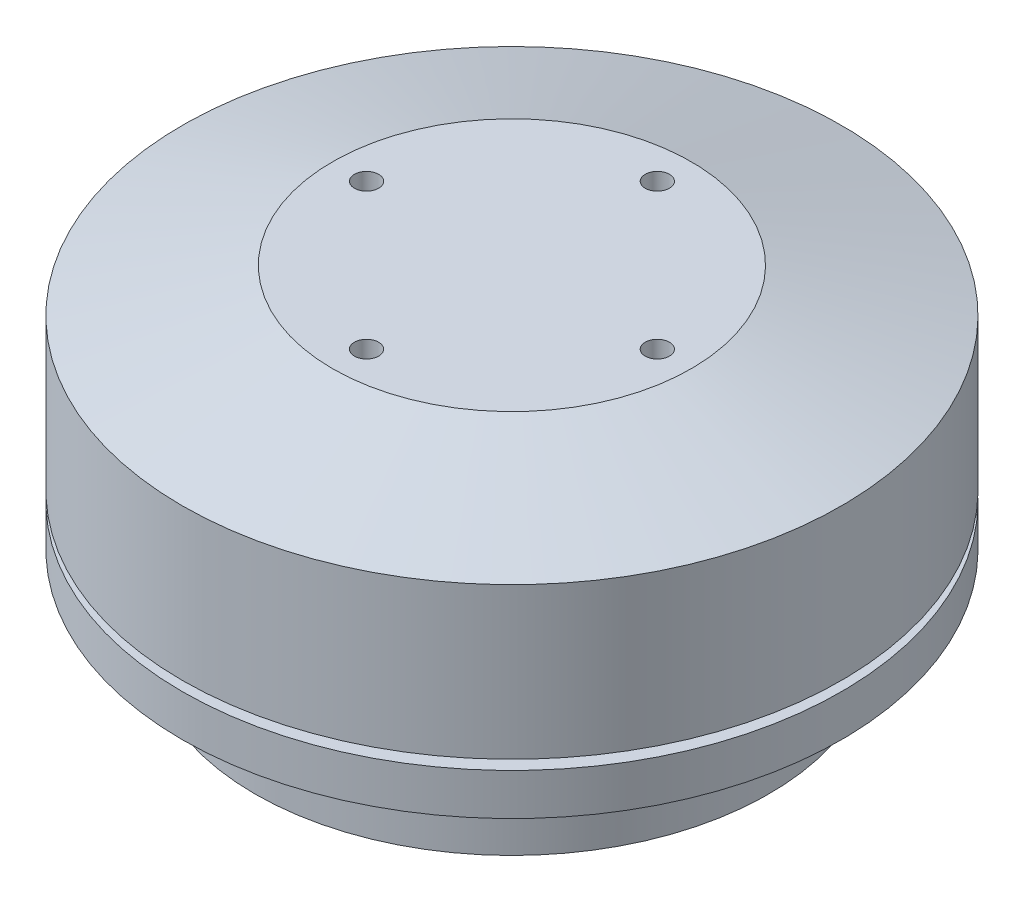
ISO-10303-21;
HEADER;
FILE_DESCRIPTION(('STEP AP214'),'2;1');
FILE_NAME('part.step','',(''),(''),'','','');
FILE_SCHEMA(('AUTOMOTIVE_DESIGN { 1 0 10303 214 1 1 1 1 }'));
ENDSEC;
DATA;
#1=APPLICATION_CONTEXT('core data for automotive mechanical design processes');
#2=APPLICATION_PROTOCOL_DEFINITION('international standard','automotive_design',2000,#1);
#3=PRODUCT_CONTEXT('',#1,'mechanical');
#4=PRODUCT('Part','Part','',(#3));
#5=PRODUCT_RELATED_PRODUCT_CATEGORY('part','',(#4));
#6=PRODUCT_DEFINITION_FORMATION('','',#4);
#7=PRODUCT_DEFINITION_CONTEXT('part definition',#1,'design');
#8=PRODUCT_DEFINITION('design','',#6,#7);
#9=PRODUCT_DEFINITION_SHAPE('','',#8);
#10=(LENGTH_UNIT() NAMED_UNIT(*) SI_UNIT(.MILLI.,.METRE.));
#11=(NAMED_UNIT(*) PLANE_ANGLE_UNIT() SI_UNIT($,.RADIAN.));
#12=(NAMED_UNIT(*) SI_UNIT($,.STERADIAN.) SOLID_ANGLE_UNIT());
#13=UNCERTAINTY_MEASURE_WITH_UNIT(LENGTH_MEASURE(1.E-05),#10,'distance_accuracy_value','');
#14=(GEOMETRIC_REPRESENTATION_CONTEXT(3) GLOBAL_UNCERTAINTY_ASSIGNED_CONTEXT((#13)) GLOBAL_UNIT_ASSIGNED_CONTEXT((#10,
#11,#12)) REPRESENTATION_CONTEXT('',''));
#15=CARTESIAN_POINT('',(0.,0.,0.));
#16=DIRECTION('',(0.,0.,1.));
#17=DIRECTION('',(1.,0.,0.));
#18=AXIS2_PLACEMENT_3D('',#15,#16,#17);
#19=CARTESIAN_POINT('',(-26.5,0.,0.));
#20=DIRECTION('',(0.,-1.,0.));
#21=DIRECTION('',(0.,0.,-1.));
#22=AXIS2_PLACEMENT_3D('',#19,#20,#21);
#23=PLANE('',#22);
#24=CARTESIAN_POINT('',(0.,0.,-15.));
#25=DIRECTION('',(0.,-1.,0.));
#26=DIRECTION('',(0.,0.,-1.));
#27=AXIS2_PLACEMENT_3D('',#24,#25,#26);
#28=CIRCLE('',#27,1.24999999999999);
#29=CARTESIAN_POINT('',(0.,0.,-16.25));
#30=VERTEX_POINT('',#29);
#31=EDGE_CURVE('E81',#30,#30,#28,.T.);
#32=ORIENTED_EDGE('',*,*,#31,.F.);
#33=EDGE_LOOP('',(#32));
#34=FACE_BOUND('',#33,.T.);
#35=CARTESIAN_POINT('',(0.,0.,15.));
#36=DIRECTION('',(0.,-1.,0.));
#37=DIRECTION('',(0.,0.,-1.));
#38=AXIS2_PLACEMENT_3D('',#35,#36,#37);
#39=CIRCLE('',#38,1.24999999999999);
#40=CARTESIAN_POINT('',(0.,0.,13.75));
#41=VERTEX_POINT('',#40);
#42=EDGE_CURVE('E80',#41,#41,#39,.T.);
#43=ORIENTED_EDGE('',*,*,#42,.F.);
#44=EDGE_LOOP('',(#43));
#45=FACE_BOUND('',#44,.T.);
#46=CARTESIAN_POINT('',(-15.,0.,0.));
#47=DIRECTION('',(0.,-1.,0.));
#48=DIRECTION('',(0.,0.,-1.));
#49=AXIS2_PLACEMENT_3D('',#46,#47,#48);
#50=CIRCLE('',#49,1.24999999999999);
#51=CARTESIAN_POINT('',(-15.,0.,-1.24999999999999));
#52=VERTEX_POINT('',#51);
#53=EDGE_CURVE('E91',#52,#52,#50,.T.);
#54=ORIENTED_EDGE('',*,*,#53,.F.);
#55=EDGE_LOOP('',(#54));
#56=FACE_BOUND('',#55,.T.);
#57=CARTESIAN_POINT('',(15.,0.,0.));
#58=DIRECTION('',(0.,-1.,0.));
#59=DIRECTION('',(0.,0.,-1.));
#60=AXIS2_PLACEMENT_3D('',#57,#58,#59);
#61=CIRCLE('',#60,1.24999999999999);
#62=CARTESIAN_POINT('',(15.,0.,-1.24999999999999));
#63=VERTEX_POINT('',#62);
#64=EDGE_CURVE('E97',#63,#63,#61,.T.);
#65=ORIENTED_EDGE('',*,*,#64,.F.);
#66=EDGE_LOOP('',(#65));
#67=FACE_BOUND('',#66,.T.);
#68=CARTESIAN_POINT('',(0.,0.,0.));
#69=DIRECTION('',(0.,1.,0.));
#70=DIRECTION('',(0.,0.,1.));
#71=AXIS2_PLACEMENT_3D('',#68,#69,#70);
#72=CIRCLE('',#71,26.5);
#73=CARTESIAN_POINT('',(0.,0.,26.5));
#74=VERTEX_POINT('',#73);
#75=EDGE_CURVE('E127',#74,#74,#72,.T.);
#76=ORIENTED_EDGE('',*,*,#75,.F.);
#77=EDGE_LOOP('',(#76));
#78=FACE_BOUND('',#77,.T.);
#79=ADVANCED_FACE('F38',(#34,#45,#56,#67,#78),#23,.T.);
#80=CARTESIAN_POINT('',(0.,34.,0.));
#81=DIRECTION('',(0.,1.,0.));
#82=DIRECTION('',(0.,0.,1.));
#83=AXIS2_PLACEMENT_3D('',#80,#81,#82);
#84=PLANE('',#83);
#85=CARTESIAN_POINT('',(0.,34.,-15.));
#86=DIRECTION('',(0.,1.,0.));
#87=DIRECTION('',(0.,0.,1.));
#88=AXIS2_PLACEMENT_3D('',#85,#86,#87);
#89=CIRCLE('',#88,1.24999999999999);
#90=CARTESIAN_POINT('',(0.,34.,-13.75));
#91=VERTEX_POINT('',#90);
#92=EDGE_CURVE('E103',#91,#91,#89,.T.);
#93=ORIENTED_EDGE('',*,*,#92,.F.);
#94=EDGE_LOOP('',(#93));
#95=FACE_BOUND('',#94,.T.);
#96=CARTESIAN_POINT('',(-15.,34.,0.));
#97=DIRECTION('',(0.,1.,0.));
#98=DIRECTION('',(0.,0.,1.));
#99=AXIS2_PLACEMENT_3D('',#96,#97,#98);
#100=CIRCLE('',#99,1.24999999999999);
#101=CARTESIAN_POINT('',(-15.,34.,1.24999999999999));
#102=VERTEX_POINT('',#101);
#103=EDGE_CURVE('E109',#102,#102,#100,.T.);
#104=ORIENTED_EDGE('',*,*,#103,.F.);
#105=EDGE_LOOP('',(#104));
#106=FACE_BOUND('',#105,.T.);
#107=CARTESIAN_POINT('',(15.,34.,0.));
#108=DIRECTION('',(0.,1.,0.));
#109=DIRECTION('',(0.,0.,1.));
#110=AXIS2_PLACEMENT_3D('',#107,#108,#109);
#111=CIRCLE('',#110,1.24999999999999);
#112=CARTESIAN_POINT('',(15.,34.,1.24999999999999));
#113=VERTEX_POINT('',#112);
#114=EDGE_CURVE('E115',#113,#113,#111,.T.);
#115=ORIENTED_EDGE('',*,*,#114,.F.);
#116=EDGE_LOOP('',(#115));
#117=FACE_BOUND('',#116,.T.);
#118=CARTESIAN_POINT('',(0.,34.,15.));
#119=DIRECTION('',(0.,1.,0.));
#120=DIRECTION('',(0.,0.,1.));
#121=AXIS2_PLACEMENT_3D('',#118,#119,#120);
#122=CIRCLE('',#121,1.24999999999999);
#123=CARTESIAN_POINT('',(0.,34.,16.25));
#124=VERTEX_POINT('',#123);
#125=EDGE_CURVE('E121',#124,#124,#122,.T.);
#126=ORIENTED_EDGE('',*,*,#125,.F.);
#127=EDGE_LOOP('',(#126));
#128=FACE_BOUND('',#127,.T.);
#129=CARTESIAN_POINT('',(0.,34.,0.));
#130=DIRECTION('',(0.,1.,0.));
#131=DIRECTION('',(0.,0.,1.));
#132=AXIS2_PLACEMENT_3D('',#129,#130,#131);
#133=CIRCLE('',#132,18.5);
#134=CARTESIAN_POINT('',(0.,34.,18.5));
#135=VERTEX_POINT('',#134);
#136=EDGE_CURVE('E11',#135,#135,#133,.T.);
#137=ORIENTED_EDGE('',*,*,#136,.T.);
#138=EDGE_LOOP('',(#137));
#139=FACE_BOUND('',#138,.T.);
#140=ADVANCED_FACE('F165',(#95,#106,#117,#128,#139),#84,.T.);
#141=CARTESIAN_POINT('',(0.,34.,0.));
#142=DIRECTION('',(0.,-1.,0.));
#143=DIRECTION('',(0.,0.,-1.));
#144=AXIS2_PLACEMENT_3D('',#141,#142,#143);
#145=CONICAL_SURFACE('',#144,18.5,1.28824137432531);
#146=CARTESIAN_POINT('',(0.,29.5,0.));
#147=DIRECTION('',(0.,1.,0.));
#148=DIRECTION('',(0.,0.,1.));
#149=AXIS2_PLACEMENT_3D('',#146,#147,#148);
#150=CIRCLE('',#149,34.);
#151=CARTESIAN_POINT('',(0.,29.5,34.));
#152=VERTEX_POINT('',#151);
#153=EDGE_CURVE('E45',#152,#152,#150,.T.);
#154=ORIENTED_EDGE('',*,*,#153,.T.);
#155=EDGE_LOOP('',(#154));
#156=FACE_BOUND('',#155,.T.);
#157=ORIENTED_EDGE('',*,*,#136,.F.);
#158=EDGE_LOOP('',(#157));
#159=FACE_BOUND('',#158,.T.);
#160=ADVANCED_FACE('F150',(#156,#159),#145,.T.);
#161=CARTESIAN_POINT('',(0.,0.,0.));
#162=DIRECTION('',(0.,1.,0.));
#163=DIRECTION('',(0.,0.,1.));
#164=AXIS2_PLACEMENT_3D('',#161,#162,#163);
#165=CYLINDRICAL_SURFACE('',#164,34.);
#166=CARTESIAN_POINT('',(0.,13.9,0.));
#167=DIRECTION('',(0.,1.,0.));
#168=DIRECTION('',(0.,0.,1.));
#169=AXIS2_PLACEMENT_3D('',#166,#167,#168);
#170=CIRCLE('',#169,34.);
#171=CARTESIAN_POINT('',(0.,13.9,34.));
#172=VERTEX_POINT('',#171);
#173=EDGE_CURVE('E145',#172,#172,#170,.T.);
#174=ORIENTED_EDGE('',*,*,#173,.T.);
#175=EDGE_LOOP('',(#174));
#176=FACE_BOUND('',#175,.T.);
#177=ORIENTED_EDGE('',*,*,#153,.F.);
#178=EDGE_LOOP('',(#177));
#179=FACE_BOUND('',#178,.T.);
#180=ADVANCED_FACE('F153',(#176,#179),#165,.T.);
#181=CARTESIAN_POINT('',(-34.,13.9,0.));
#182=DIRECTION('',(0.,-1.,0.));
#183=DIRECTION('',(0.,0.,-1.));
#184=AXIS2_PLACEMENT_3D('',#181,#182,#183);
#185=PLANE('',#184);
#186=CARTESIAN_POINT('',(0.,13.9,0.));
#187=DIRECTION('',(0.,1.,0.));
#188=DIRECTION('',(0.,0.,1.));
#189=AXIS2_PLACEMENT_3D('',#186,#187,#188);
#190=CIRCLE('',#189,32.5204744932251);
#191=CARTESIAN_POINT('',(0.,13.9,32.5204744932251));
#192=VERTEX_POINT('',#191);
#193=EDGE_CURVE('E142',#192,#192,#190,.T.);
#194=ORIENTED_EDGE('',*,*,#193,.T.);
#195=EDGE_LOOP('',(#194));
#196=FACE_BOUND('',#195,.T.);
#197=ORIENTED_EDGE('',*,*,#173,.F.);
#198=EDGE_LOOP('',(#197));
#199=FACE_BOUND('',#198,.T.);
#200=ADVANCED_FACE('F155',(#196,#199),#185,.T.);
#201=CARTESIAN_POINT('',(0.,0.,0.));
#202=DIRECTION('',(0.,1.,0.));
#203=DIRECTION('',(0.,0.,1.));
#204=AXIS2_PLACEMENT_3D('',#201,#202,#203);
#205=CYLINDRICAL_SURFACE('',#204,32.5204744932251);
#206=CARTESIAN_POINT('',(0.,12.9,0.));
#207=DIRECTION('',(0.,1.,0.));
#208=DIRECTION('',(0.,0.,1.));
#209=AXIS2_PLACEMENT_3D('',#206,#207,#208);
#210=CIRCLE('',#209,32.5204744932251);
#211=CARTESIAN_POINT('',(0.,12.9,32.5204744932251));
#212=VERTEX_POINT('',#211);
#213=EDGE_CURVE('E139',#212,#212,#210,.T.);
#214=ORIENTED_EDGE('',*,*,#213,.T.);
#215=EDGE_LOOP('',(#214));
#216=FACE_BOUND('',#215,.T.);
#217=ORIENTED_EDGE('',*,*,#193,.F.);
#218=EDGE_LOOP('',(#217));
#219=FACE_BOUND('',#218,.T.);
#220=ADVANCED_FACE('F162',(#216,#219),#205,.T.);
#221=CARTESIAN_POINT('',(-32.5204744932251,12.9,0.));
#222=DIRECTION('',(0.,1.,0.));
#223=DIRECTION('',(0.,0.,1.));
#224=AXIS2_PLACEMENT_3D('',#221,#222,#223);
#225=PLANE('',#224);
#226=CARTESIAN_POINT('',(0.,12.9,0.));
#227=DIRECTION('',(0.,1.,0.));
#228=DIRECTION('',(0.,0.,1.));
#229=AXIS2_PLACEMENT_3D('',#226,#227,#228);
#230=CIRCLE('',#229,34.);
#231=CARTESIAN_POINT('',(0.,12.9,34.));
#232=VERTEX_POINT('',#231);
#233=EDGE_CURVE('E136',#232,#232,#230,.T.);
#234=ORIENTED_EDGE('',*,*,#233,.T.);
#235=EDGE_LOOP('',(#234));
#236=FACE_BOUND('',#235,.T.);
#237=ORIENTED_EDGE('',*,*,#213,.F.);
#238=EDGE_LOOP('',(#237));
#239=FACE_BOUND('',#238,.T.);
#240=ADVANCED_FACE('F199',(#236,#239),#225,.T.);
#241=CARTESIAN_POINT('',(0.,0.,0.));
#242=DIRECTION('',(0.,1.,0.));
#243=DIRECTION('',(0.,0.,1.));
#244=AXIS2_PLACEMENT_3D('',#241,#242,#243);
#245=CYLINDRICAL_SURFACE('',#244,34.);
#246=CARTESIAN_POINT('',(0.,8.6,0.));
#247=DIRECTION('',(0.,1.,0.));
#248=DIRECTION('',(0.,0.,1.));
#249=AXIS2_PLACEMENT_3D('',#246,#247,#248);
#250=CIRCLE('',#249,34.);
#251=CARTESIAN_POINT('',(0.,8.6,34.));
#252=VERTEX_POINT('',#251);
#253=EDGE_CURVE('E133',#252,#252,#250,.T.);
#254=ORIENTED_EDGE('',*,*,#253,.T.);
#255=EDGE_LOOP('',(#254));
#256=FACE_BOUND('',#255,.T.);
#257=ORIENTED_EDGE('',*,*,#233,.F.);
#258=EDGE_LOOP('',(#257));
#259=FACE_BOUND('',#258,.T.);
#260=ADVANCED_FACE('F193',(#256,#259),#245,.T.);
#261=CARTESIAN_POINT('',(0.,8.6,0.));
#262=DIRECTION('',(0.,1.,0.));
#263=DIRECTION('',(0.,0.,1.));
#264=AXIS2_PLACEMENT_3D('',#261,#262,#263);
#265=CONICAL_SURFACE('',#264,34.,1.19028994968253);
#266=CARTESIAN_POINT('',(0.,5.6,0.));
#267=DIRECTION('',(0.,1.,0.));
#268=DIRECTION('',(0.,0.,1.));
#269=AXIS2_PLACEMENT_3D('',#266,#267,#268);
#270=CIRCLE('',#269,26.5);
#271=CARTESIAN_POINT('',(0.,5.6,26.5));
#272=VERTEX_POINT('',#271);
#273=EDGE_CURVE('E130',#272,#272,#270,.T.);
#274=ORIENTED_EDGE('',*,*,#273,.T.);
#275=EDGE_LOOP('',(#274));
#276=FACE_BOUND('',#275,.T.);
#277=ORIENTED_EDGE('',*,*,#253,.F.);
#278=EDGE_LOOP('',(#277));
#279=FACE_BOUND('',#278,.T.);
#280=ADVANCED_FACE('F187',(#276,#279),#265,.T.);
#281=CARTESIAN_POINT('',(0.,0.,0.));
#282=DIRECTION('',(0.,1.,0.));
#283=DIRECTION('',(0.,0.,1.));
#284=AXIS2_PLACEMENT_3D('',#281,#282,#283);
#285=CYLINDRICAL_SURFACE('',#284,26.5);
#286=ORIENTED_EDGE('',*,*,#75,.T.);
#287=EDGE_LOOP('',(#286));
#288=FACE_BOUND('',#287,.T.);
#289=ORIENTED_EDGE('',*,*,#273,.F.);
#290=EDGE_LOOP('',(#289));
#291=FACE_BOUND('',#290,.T.);
#292=ADVANCED_FACE('F183',(#288,#291),#285,.T.);
#293=CARTESIAN_POINT('',(0.,28.,15.));
#294=DIRECTION('',(0.,1.,0.));
#295=DIRECTION('',(0.,0.,1.));
#296=AXIS2_PLACEMENT_3D('',#293,#294,#295);
#297=CONICAL_SURFACE('',#296,1.25,1.02974425867665);
#298=CARTESIAN_POINT('',(0.,27.2489242262156,15.));
#299=VERTEX_POINT('',#298);
#300=VERTEX_LOOP('',#299);
#301=FACE_BOUND('',#300,.T.);
#302=CARTESIAN_POINT('',(0.,28.,15.));
#303=DIRECTION('',(0.,1.,0.));
#304=DIRECTION('',(0.,0.,1.));
#305=AXIS2_PLACEMENT_3D('',#302,#303,#304);
#306=CIRCLE('',#305,1.25);
#307=CARTESIAN_POINT('',(0.,28.,16.25));
#308=VERTEX_POINT('',#307);
#309=EDGE_CURVE('E124',#308,#308,#306,.T.);
#310=ORIENTED_EDGE('',*,*,#309,.T.);
#311=EDGE_LOOP('',(#310));
#312=FACE_BOUND('',#311,.T.);
#313=ADVANCED_FACE('F186',(#301,#312),#297,.F.);
#314=CARTESIAN_POINT('',(0.,34.,15.));
#315=DIRECTION('',(0.,1.,0.));
#316=DIRECTION('',(0.,0.,1.));
#317=AXIS2_PLACEMENT_3D('',#314,#315,#316);
#318=CYLINDRICAL_SURFACE('',#317,1.24999999999999);
#319=ORIENTED_EDGE('',*,*,#309,.F.);
#320=EDGE_LOOP('',(#319));
#321=FACE_BOUND('',#320,.T.);
#322=ORIENTED_EDGE('',*,*,#125,.T.);
#323=EDGE_LOOP('',(#322));
#324=FACE_BOUND('',#323,.T.);
#325=ADVANCED_FACE('F219',(#321,#324),#318,.F.);
#326=CARTESIAN_POINT('',(15.,28.,0.));
#327=DIRECTION('',(0.,1.,0.));
#328=DIRECTION('',(0.,0.,1.));
#329=AXIS2_PLACEMENT_3D('',#326,#327,#328);
#330=CONICAL_SURFACE('',#329,1.25,1.02974425867665);
#331=CARTESIAN_POINT('',(15.,27.2489242262156,0.));
#332=VERTEX_POINT('',#331);
#333=VERTEX_LOOP('',#332);
#334=FACE_BOUND('',#333,.T.);
#335=CARTESIAN_POINT('',(15.,28.,0.));
#336=DIRECTION('',(0.,1.,0.));
#337=DIRECTION('',(0.,0.,1.));
#338=AXIS2_PLACEMENT_3D('',#335,#336,#337);
#339=CIRCLE('',#338,1.25);
#340=CARTESIAN_POINT('',(15.,28.,1.25));
#341=VERTEX_POINT('',#340);
#342=EDGE_CURVE('E118',#341,#341,#339,.T.);
#343=ORIENTED_EDGE('',*,*,#342,.T.);
#344=EDGE_LOOP('',(#343));
#345=FACE_BOUND('',#344,.T.);
#346=ADVANCED_FACE('F222',(#334,#345),#330,.F.);
#347=CARTESIAN_POINT('',(15.,34.,0.));
#348=DIRECTION('',(0.,1.,0.));
#349=DIRECTION('',(0.,0.,1.));
#350=AXIS2_PLACEMENT_3D('',#347,#348,#349);
#351=CYLINDRICAL_SURFACE('',#350,1.24999999999999);
#352=ORIENTED_EDGE('',*,*,#342,.F.);
#353=EDGE_LOOP('',(#352));
#354=FACE_BOUND('',#353,.T.);
#355=ORIENTED_EDGE('',*,*,#114,.T.);
#356=EDGE_LOOP('',(#355));
#357=FACE_BOUND('',#356,.T.);
#358=ADVANCED_FACE('F226',(#354,#357),#351,.F.);
#359=CARTESIAN_POINT('',(-15.,28.,0.));
#360=DIRECTION('',(0.,1.,0.));
#361=DIRECTION('',(0.,0.,1.));
#362=AXIS2_PLACEMENT_3D('',#359,#360,#361);
#363=CONICAL_SURFACE('',#362,1.25,1.02974425867665);
#364=CARTESIAN_POINT('',(-15.,27.2489242262156,0.));
#365=VERTEX_POINT('',#364);
#366=VERTEX_LOOP('',#365);
#367=FACE_BOUND('',#366,.T.);
#368=CARTESIAN_POINT('',(-15.,28.,0.));
#369=DIRECTION('',(0.,1.,0.));
#370=DIRECTION('',(0.,0.,1.));
#371=AXIS2_PLACEMENT_3D('',#368,#369,#370);
#372=CIRCLE('',#371,1.25);
#373=CARTESIAN_POINT('',(-15.,28.,1.25));
#374=VERTEX_POINT('',#373);
#375=EDGE_CURVE('E112',#374,#374,#372,.T.);
#376=ORIENTED_EDGE('',*,*,#375,.T.);
#377=EDGE_LOOP('',(#376));
#378=FACE_BOUND('',#377,.T.);
#379=ADVANCED_FACE('F229',(#367,#378),#363,.F.);
#380=CARTESIAN_POINT('',(-15.,34.,0.));
#381=DIRECTION('',(0.,1.,0.));
#382=DIRECTION('',(0.,0.,1.));
#383=AXIS2_PLACEMENT_3D('',#380,#381,#382);
#384=CYLINDRICAL_SURFACE('',#383,1.24999999999999);
#385=ORIENTED_EDGE('',*,*,#375,.F.);
#386=EDGE_LOOP('',(#385));
#387=FACE_BOUND('',#386,.T.);
#388=ORIENTED_EDGE('',*,*,#103,.T.);
#389=EDGE_LOOP('',(#388));
#390=FACE_BOUND('',#389,.T.);
#391=ADVANCED_FACE('F233',(#387,#390),#384,.F.);
#392=CARTESIAN_POINT('',(0.,28.,-15.));
#393=DIRECTION('',(0.,1.,0.));
#394=DIRECTION('',(0.,0.,1.));
#395=AXIS2_PLACEMENT_3D('',#392,#393,#394);
#396=CONICAL_SURFACE('',#395,1.25,1.02974425867665);
#397=CARTESIAN_POINT('',(0.,27.2489242262156,-15.));
#398=VERTEX_POINT('',#397);
#399=VERTEX_LOOP('',#398);
#400=FACE_BOUND('',#399,.T.);
#401=CARTESIAN_POINT('',(0.,28.,-15.));
#402=DIRECTION('',(0.,1.,0.));
#403=DIRECTION('',(0.,0.,1.));
#404=AXIS2_PLACEMENT_3D('',#401,#402,#403);
#405=CIRCLE('',#404,1.25);
#406=CARTESIAN_POINT('',(0.,28.,-13.75));
#407=VERTEX_POINT('',#406);
#408=EDGE_CURVE('E106',#407,#407,#405,.T.);
#409=ORIENTED_EDGE('',*,*,#408,.T.);
#410=EDGE_LOOP('',(#409));
#411=FACE_BOUND('',#410,.T.);
#412=ADVANCED_FACE('F237',(#400,#411),#396,.F.);
#413=CARTESIAN_POINT('',(0.,34.,-15.));
#414=DIRECTION('',(0.,1.,0.));
#415=DIRECTION('',(0.,0.,1.));
#416=AXIS2_PLACEMENT_3D('',#413,#414,#415);
#417=CYLINDRICAL_SURFACE('',#416,1.24999999999999);
#418=ORIENTED_EDGE('',*,*,#408,.F.);
#419=EDGE_LOOP('',(#418));
#420=FACE_BOUND('',#419,.T.);
#421=ORIENTED_EDGE('',*,*,#92,.T.);
#422=EDGE_LOOP('',(#421));
#423=FACE_BOUND('',#422,.T.);
#424=ADVANCED_FACE('F241',(#420,#423),#417,.F.);
#425=CARTESIAN_POINT('',(15.,8.5,0.));
#426=DIRECTION('',(0.,-1.,0.));
#427=DIRECTION('',(0.,0.,-1.));
#428=AXIS2_PLACEMENT_3D('',#425,#426,#427);
#429=CONICAL_SURFACE('',#428,1.25,1.02974425867665);
#430=CARTESIAN_POINT('',(15.,9.25107577378445,0.));
#431=VERTEX_POINT('',#430);
#432=VERTEX_LOOP('',#431);
#433=FACE_BOUND('',#432,.T.);
#434=CARTESIAN_POINT('',(15.,8.5,0.));
#435=DIRECTION('',(0.,-1.,0.));
#436=DIRECTION('',(0.,0.,-1.));
#437=AXIS2_PLACEMENT_3D('',#434,#435,#436);
#438=CIRCLE('',#437,1.25);
#439=CARTESIAN_POINT('',(15.,8.5,-1.25));
#440=VERTEX_POINT('',#439);
#441=EDGE_CURVE('E100',#440,#440,#438,.T.);
#442=ORIENTED_EDGE('',*,*,#441,.T.);
#443=EDGE_LOOP('',(#442));
#444=FACE_BOUND('',#443,.T.);
#445=ADVANCED_FACE('F245',(#433,#444),#429,.F.);
#446=CARTESIAN_POINT('',(15.,0.,0.));
#447=DIRECTION('',(0.,-1.,0.));
#448=DIRECTION('',(0.,0.,-1.));
#449=AXIS2_PLACEMENT_3D('',#446,#447,#448);
#450=CYLINDRICAL_SURFACE('',#449,1.24999999999999);
#451=ORIENTED_EDGE('',*,*,#441,.F.);
#452=EDGE_LOOP('',(#451));
#453=FACE_BOUND('',#452,.T.);
#454=ORIENTED_EDGE('',*,*,#64,.T.);
#455=EDGE_LOOP('',(#454));
#456=FACE_BOUND('',#455,.T.);
#457=ADVANCED_FACE('F249',(#453,#456),#450,.F.);
#458=CARTESIAN_POINT('',(-15.,8.5,0.));
#459=DIRECTION('',(0.,-1.,0.));
#460=DIRECTION('',(0.,0.,-1.));
#461=AXIS2_PLACEMENT_3D('',#458,#459,#460);
#462=CONICAL_SURFACE('',#461,1.25,1.02974425867665);
#463=CARTESIAN_POINT('',(-15.,9.25107577378445,0.));
#464=VERTEX_POINT('',#463);
#465=VERTEX_LOOP('',#464);
#466=FACE_BOUND('',#465,.T.);
#467=CARTESIAN_POINT('',(-15.,8.5,0.));
#468=DIRECTION('',(0.,-1.,0.));
#469=DIRECTION('',(0.,0.,-1.));
#470=AXIS2_PLACEMENT_3D('',#467,#468,#469);
#471=CIRCLE('',#470,1.25);
#472=CARTESIAN_POINT('',(-15.,8.5,-1.25));
#473=VERTEX_POINT('',#472);
#474=EDGE_CURVE('E94',#473,#473,#471,.T.);
#475=ORIENTED_EDGE('',*,*,#474,.T.);
#476=EDGE_LOOP('',(#475));
#477=FACE_BOUND('',#476,.T.);
#478=ADVANCED_FACE('F253',(#466,#477),#462,.F.);
#479=CARTESIAN_POINT('',(-15.,0.,0.));
#480=DIRECTION('',(0.,-1.,0.));
#481=DIRECTION('',(0.,0.,-1.));
#482=AXIS2_PLACEMENT_3D('',#479,#480,#481);
#483=CYLINDRICAL_SURFACE('',#482,1.24999999999999);
#484=ORIENTED_EDGE('',*,*,#474,.F.);
#485=EDGE_LOOP('',(#484));
#486=FACE_BOUND('',#485,.T.);
#487=ORIENTED_EDGE('',*,*,#53,.T.);
#488=EDGE_LOOP('',(#487));
#489=FACE_BOUND('',#488,.T.);
#490=ADVANCED_FACE('F257',(#486,#489),#483,.F.);
#491=CARTESIAN_POINT('',(0.,8.5,15.));
#492=DIRECTION('',(0.,-1.,0.));
#493=DIRECTION('',(0.,0.,-1.));
#494=AXIS2_PLACEMENT_3D('',#491,#492,#493);
#495=CONICAL_SURFACE('',#494,1.25,1.02974425867665);
#496=CARTESIAN_POINT('',(0.,9.25107577378445,15.));
#497=VERTEX_POINT('',#496);
#498=VERTEX_LOOP('',#497);
#499=FACE_BOUND('',#498,.T.);
#500=CARTESIAN_POINT('',(0.,8.5,15.));
#501=DIRECTION('',(0.,-1.,0.));
#502=DIRECTION('',(0.,0.,-1.));
#503=AXIS2_PLACEMENT_3D('',#500,#501,#502);
#504=CIRCLE('',#503,1.25);
#505=CARTESIAN_POINT('',(0.,8.5,13.75));
#506=VERTEX_POINT('',#505);
#507=EDGE_CURVE('E84',#506,#506,#504,.T.);
#508=ORIENTED_EDGE('',*,*,#507,.T.);
#509=EDGE_LOOP('',(#508));
#510=FACE_BOUND('',#509,.T.);
#511=ADVANCED_FACE('F261',(#499,#510),#495,.F.);
#512=CARTESIAN_POINT('',(0.,0.,15.));
#513=DIRECTION('',(0.,-1.,0.));
#514=DIRECTION('',(0.,0.,-1.));
#515=AXIS2_PLACEMENT_3D('',#512,#513,#514);
#516=CYLINDRICAL_SURFACE('',#515,1.24999999999999);
#517=ORIENTED_EDGE('',*,*,#507,.F.);
#518=EDGE_LOOP('',(#517));
#519=FACE_BOUND('',#518,.T.);
#520=ORIENTED_EDGE('',*,*,#42,.T.);
#521=EDGE_LOOP('',(#520));
#522=FACE_BOUND('',#521,.T.);
#523=ADVANCED_FACE('F74',(#519,#522),#516,.F.);
#524=CARTESIAN_POINT('',(0.,8.5,-15.));
#525=DIRECTION('',(0.,-1.,0.));
#526=DIRECTION('',(0.,0.,-1.));
#527=AXIS2_PLACEMENT_3D('',#524,#525,#526);
#528=CONICAL_SURFACE('',#527,1.25,1.02974425867665);
#529=CARTESIAN_POINT('',(0.,9.25107577378445,-15.));
#530=VERTEX_POINT('',#529);
#531=VERTEX_LOOP('',#530);
#532=FACE_BOUND('',#531,.T.);
#533=CARTESIAN_POINT('',(0.,8.5,-15.));
#534=DIRECTION('',(0.,-1.,0.));
#535=DIRECTION('',(0.,0.,-1.));
#536=AXIS2_PLACEMENT_3D('',#533,#534,#535);
#537=CIRCLE('',#536,1.25);
#538=CARTESIAN_POINT('',(0.,8.5,-16.25));
#539=VERTEX_POINT('',#538);
#540=EDGE_CURVE('E78',#539,#539,#537,.T.);
#541=ORIENTED_EDGE('',*,*,#540,.T.);
#542=EDGE_LOOP('',(#541));
#543=FACE_BOUND('',#542,.T.);
#544=ADVANCED_FACE('F70',(#532,#543),#528,.F.);
#545=CARTESIAN_POINT('',(0.,0.,-15.));
#546=DIRECTION('',(0.,-1.,0.));
#547=DIRECTION('',(0.,0.,-1.));
#548=AXIS2_PLACEMENT_3D('',#545,#546,#547);
#549=CYLINDRICAL_SURFACE('',#548,1.24999999999999);
#550=ORIENTED_EDGE('',*,*,#540,.F.);
#551=EDGE_LOOP('',(#550));
#552=FACE_BOUND('',#551,.T.);
#553=ORIENTED_EDGE('',*,*,#31,.T.);
#554=EDGE_LOOP('',(#553));
#555=FACE_BOUND('',#554,.T.);
#556=ADVANCED_FACE('F73',(#552,#555),#549,.F.);
#557=CLOSED_SHELL('',(#79,#140,#160,#180,#200,#220,#240,#260,#280,#292,#313,#325,#346,#358,#379,
#391,#412,#424,#445,#457,#478,#490,#511,#523,#544,#556));
#558=MANIFOLD_SOLID_BREP('B2',#557);
#559=ADVANCED_BREP_SHAPE_REPRESENTATION('',(#18,#558),#14);
#560=SHAPE_DEFINITION_REPRESENTATION(#9,#559);
ENDSEC;
END-ISO-10303-21;
